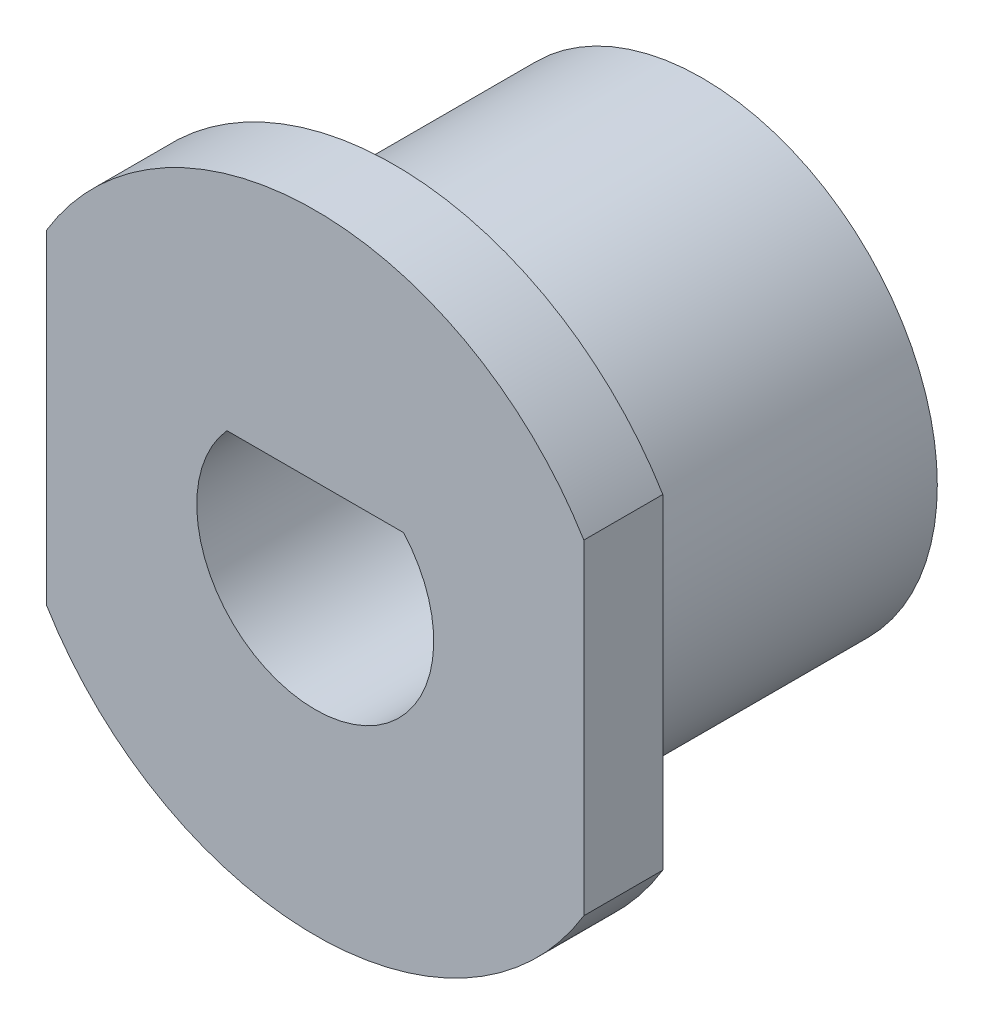
ISO-10303-21;
HEADER;
FILE_DESCRIPTION(('STEP AP214'),'2;1');
FILE_NAME('part.step','',(''),(''),'','','');
FILE_SCHEMA(('AUTOMOTIVE_DESIGN { 1 0 10303 214 1 1 1 1 }'));
ENDSEC;
DATA;
#1=APPLICATION_CONTEXT('core data for automotive mechanical design processes');
#2=APPLICATION_PROTOCOL_DEFINITION('international standard','automotive_design',2000,#1);
#3=PRODUCT_CONTEXT('',#1,'mechanical');
#4=PRODUCT('Part','Part','',(#3));
#5=PRODUCT_RELATED_PRODUCT_CATEGORY('part','',(#4));
#6=PRODUCT_DEFINITION_FORMATION('','',#4);
#7=PRODUCT_DEFINITION_CONTEXT('part definition',#1,'design');
#8=PRODUCT_DEFINITION('design','',#6,#7);
#9=PRODUCT_DEFINITION_SHAPE('','',#8);
#10=(LENGTH_UNIT() NAMED_UNIT(*) SI_UNIT(.MILLI.,.METRE.));
#11=(NAMED_UNIT(*) PLANE_ANGLE_UNIT() SI_UNIT($,.RADIAN.));
#12=(NAMED_UNIT(*) SI_UNIT($,.STERADIAN.) SOLID_ANGLE_UNIT());
#13=UNCERTAINTY_MEASURE_WITH_UNIT(LENGTH_MEASURE(1.E-05),#10,'distance_accuracy_value','');
#14=(GEOMETRIC_REPRESENTATION_CONTEXT(3) GLOBAL_UNCERTAINTY_ASSIGNED_CONTEXT((#13)) GLOBAL_UNIT_ASSIGNED_CONTEXT((#10,
#11,#12)) REPRESENTATION_CONTEXT('',''));
#15=CARTESIAN_POINT('',(0.,0.,0.));
#16=DIRECTION('',(0.,0.,1.));
#17=DIRECTION('',(1.,0.,0.));
#18=AXIS2_PLACEMENT_3D('',#15,#16,#17);
#19=CARTESIAN_POINT('',(0.,0.,4.9));
#20=DIRECTION('',(0.,0.,-1.));
#21=DIRECTION('',(-1.,0.,0.));
#22=AXIS2_PLACEMENT_3D('',#19,#20,#21);
#23=CYLINDRICAL_SURFACE('',#22,2.975);
#24=CARTESIAN_POINT('',(0.,0.,0.));
#25=DIRECTION('',(0.,0.,1.));
#26=DIRECTION('',(1.,0.,0.));
#27=AXIS2_PLACEMENT_3D('',#24,#25,#26);
#28=CIRCLE('',#27,2.975);
#29=CARTESIAN_POINT('',(2.975,0.,0.));
#30=VERTEX_POINT('',#29);
#31=EDGE_CURVE('E130',#30,#30,#28,.T.);
#32=ORIENTED_EDGE('',*,*,#31,.T.);
#33=EDGE_LOOP('',(#32));
#34=FACE_BOUND('',#33,.T.);
#35=CARTESIAN_POINT('',(0.,0.,3.9));
#36=DIRECTION('',(0.,0.,1.));
#37=DIRECTION('',(1.,0.,0.));
#38=AXIS2_PLACEMENT_3D('',#35,#36,#37);
#39=CIRCLE('',#38,2.975);
#40=CARTESIAN_POINT('',(2.975,0.,3.9));
#41=VERTEX_POINT('',#40);
#42=EDGE_CURVE('E11',#41,#41,#39,.T.);
#43=ORIENTED_EDGE('',*,*,#42,.F.);
#44=EDGE_LOOP('',(#43));
#45=FACE_BOUND('',#44,.T.);
#46=ADVANCED_FACE('F39',(#34,#45),#23,.T.);
#47=CARTESIAN_POINT('',(0.,0.,4.9));
#48=DIRECTION('',(0.,0.,-1.));
#49=DIRECTION('',(-1.,0.,0.));
#50=AXIS2_PLACEMENT_3D('',#47,#48,#49);
#51=CYLINDRICAL_SURFACE('',#50,1.5);
#52=CARTESIAN_POINT('',(0.,0.,0.));
#53=DIRECTION('',(0.,0.,1.));
#54=DIRECTION('',(1.,0.,0.));
#55=AXIS2_PLACEMENT_3D('',#52,#53,#54);
#56=CIRCLE('',#55,1.5);
#57=CARTESIAN_POINT('',(-1.1180339887499,1.,0.));
#58=VERTEX_POINT('',#57);
#59=CARTESIAN_POINT('',(1.1180339887499,1.,0.));
#60=VERTEX_POINT('',#59);
#61=EDGE_CURVE('E132',#58,#60,#56,.T.);
#62=ORIENTED_EDGE('',*,*,#61,.F.);
#63=DIRECTION('',(0.,0.,-1.));
#64=VECTOR('',#63,1.);
#65=CARTESIAN_POINT('',(-1.1180339887499,1.,4.9));
#66=LINE('',#65,#64);
#67=CARTESIAN_POINT('',(-1.1180339887499,1.,4.9));
#68=VERTEX_POINT('',#67);
#69=EDGE_CURVE('E48',#68,#58,#66,.T.);
#70=ORIENTED_EDGE('',*,*,#69,.F.);
#71=CARTESIAN_POINT('',(0.,0.,4.9));
#72=DIRECTION('',(0.,0.,1.));
#73=DIRECTION('',(1.,0.,0.));
#74=AXIS2_PLACEMENT_3D('',#71,#72,#73);
#75=CIRCLE('',#74,1.5);
#76=CARTESIAN_POINT('',(1.1180339887499,1.,4.9));
#77=VERTEX_POINT('',#76);
#78=EDGE_CURVE('E127',#68,#77,#75,.T.);
#79=ORIENTED_EDGE('',*,*,#78,.T.);
#80=DIRECTION('',(0.,0.,-1.));
#81=VECTOR('',#80,1.);
#82=CARTESIAN_POINT('',(1.1180339887499,1.,4.9));
#83=LINE('',#82,#81);
#84=EDGE_CURVE('E56',#77,#60,#83,.T.);
#85=ORIENTED_EDGE('',*,*,#84,.T.);
#86=EDGE_LOOP('',(#62,#70,#79,#85));
#87=FACE_BOUND('',#86,.T.);
#88=ADVANCED_FACE('F41',(#87),#51,.F.);
#89=CARTESIAN_POINT('',(0.,1.,4.9));
#90=DIRECTION('',(0.,-1.,0.));
#91=DIRECTION('',(0.,0.,-1.));
#92=AXIS2_PLACEMENT_3D('',#89,#90,#91);
#93=PLANE('',#92);
#94=DIRECTION('',(-1.,0.,0.));
#95=VECTOR('',#94,1.);
#96=CARTESIAN_POINT('',(0.,1.,0.));
#97=LINE('',#96,#95);
#98=EDGE_CURVE('E135',#60,#58,#97,.T.);
#99=ORIENTED_EDGE('',*,*,#98,.F.);
#100=ORIENTED_EDGE('',*,*,#84,.F.);
#101=DIRECTION('',(-1.,0.,0.));
#102=VECTOR('',#101,1.);
#103=CARTESIAN_POINT('',(0.,1.,4.9));
#104=LINE('',#103,#102);
#105=EDGE_CURVE('E129',#77,#68,#104,.T.);
#106=ORIENTED_EDGE('',*,*,#105,.T.);
#107=ORIENTED_EDGE('',*,*,#69,.T.);
#108=EDGE_LOOP('',(#99,#100,#106,#107));
#109=FACE_BOUND('',#108,.T.);
#110=ADVANCED_FACE('F146',(#109),#93,.T.);
#111=CARTESIAN_POINT('',(0.,0.,4.9));
#112=DIRECTION('',(0.,0.,1.));
#113=DIRECTION('',(1.,0.,0.));
#114=AXIS2_PLACEMENT_3D('',#111,#112,#113);
#115=PLANE('',#114);
#116=ORIENTED_EDGE('',*,*,#78,.F.);
#117=ORIENTED_EDGE('',*,*,#105,.F.);
#118=EDGE_LOOP('',(#116,#117));
#119=FACE_BOUND('',#118,.T.);
#120=DIRECTION('',(0.,-1.,0.));
#121=VECTOR('',#120,1.);
#122=CARTESIAN_POINT('',(3.4,0.,4.9));
#123=LINE('',#122,#121);
#124=CARTESIAN_POINT('',(3.4,2.05927778602111,4.9));
#125=VERTEX_POINT('',#124);
#126=CARTESIAN_POINT('',(3.4,-2.05927778602111,4.9));
#127=VERTEX_POINT('',#126);
#128=EDGE_CURVE('E247',#125,#127,#123,.T.);
#129=ORIENTED_EDGE('',*,*,#128,.F.);
#130=CARTESIAN_POINT('',(0.,0.,4.9));
#131=DIRECTION('',(0.,0.,1.));
#132=DIRECTION('',(1.,0.,0.));
#133=AXIS2_PLACEMENT_3D('',#130,#131,#132);
#134=CIRCLE('',#133,3.975);
#135=CARTESIAN_POINT('',(-3.4,2.05927778602111,4.9));
#136=VERTEX_POINT('',#135);
#137=EDGE_CURVE('E244',#125,#136,#134,.T.);
#138=ORIENTED_EDGE('',*,*,#137,.T.);
#139=DIRECTION('',(0.,-1.,0.));
#140=VECTOR('',#139,1.);
#141=CARTESIAN_POINT('',(-3.4,0.,4.9));
#142=LINE('',#141,#140);
#143=CARTESIAN_POINT('',(-3.4,-2.05927778602111,4.9));
#144=VERTEX_POINT('',#143);
#145=EDGE_CURVE('E110',#136,#144,#142,.T.);
#146=ORIENTED_EDGE('',*,*,#145,.T.);
#147=EDGE_CURVE('E120',#144,#127,#134,.T.);
#148=ORIENTED_EDGE('',*,*,#147,.T.);
#149=EDGE_LOOP('',(#129,#138,#146,#148));
#150=FACE_BOUND('',#149,.T.);
#151=ADVANCED_FACE('F148',(#119,#150),#115,.T.);
#152=CARTESIAN_POINT('',(0.,0.,0.));
#153=DIRECTION('',(0.,0.,1.));
#154=DIRECTION('',(1.,0.,0.));
#155=AXIS2_PLACEMENT_3D('',#152,#153,#154);
#156=PLANE('',#155);
#157=ORIENTED_EDGE('',*,*,#61,.T.);
#158=ORIENTED_EDGE('',*,*,#98,.T.);
#159=EDGE_LOOP('',(#157,#158));
#160=FACE_BOUND('',#159,.T.);
#161=ORIENTED_EDGE('',*,*,#31,.F.);
#162=EDGE_LOOP('',(#161));
#163=FACE_BOUND('',#162,.T.);
#164=ADVANCED_FACE('F144',(#160,#163),#156,.F.);
#165=CARTESIAN_POINT('',(3.4,0.,3.9));
#166=DIRECTION('',(-1.,0.,0.));
#167=DIRECTION('',(0.,0.,1.));
#168=AXIS2_PLACEMENT_3D('',#165,#166,#167);
#169=PLANE('',#168);
#170=ORIENTED_EDGE('',*,*,#128,.T.);
#171=DIRECTION('',(0.,0.,1.));
#172=VECTOR('',#171,1.);
#173=CARTESIAN_POINT('',(3.4,-2.05927778602111,3.9));
#174=LINE('',#173,#172);
#175=CARTESIAN_POINT('',(3.4,-2.05927778602111,3.9));
#176=VERTEX_POINT('',#175);
#177=EDGE_CURVE('E93',#176,#127,#174,.T.);
#178=ORIENTED_EDGE('',*,*,#177,.F.);
#179=DIRECTION('',(0.,-1.,0.));
#180=VECTOR('',#179,1.);
#181=CARTESIAN_POINT('',(3.4,0.,3.9));
#182=LINE('',#181,#180);
#183=CARTESIAN_POINT('',(3.4,2.05927778602111,3.9));
#184=VERTEX_POINT('',#183);
#185=EDGE_CURVE('E72',#184,#176,#182,.T.);
#186=ORIENTED_EDGE('',*,*,#185,.F.);
#187=DIRECTION('',(0.,0.,1.));
#188=VECTOR('',#187,1.);
#189=CARTESIAN_POINT('',(3.4,2.05927778602111,3.9));
#190=LINE('',#189,#188);
#191=EDGE_CURVE('E100',#184,#125,#190,.T.);
#192=ORIENTED_EDGE('',*,*,#191,.T.);
#193=EDGE_LOOP('',(#170,#178,#186,#192));
#194=FACE_BOUND('',#193,.T.);
#195=ADVANCED_FACE('F163',(#194),#169,.F.);
#196=CARTESIAN_POINT('',(0.,0.,3.9));
#197=DIRECTION('',(0.,0.,1.));
#198=DIRECTION('',(1.,0.,0.));
#199=AXIS2_PLACEMENT_3D('',#196,#197,#198);
#200=CYLINDRICAL_SURFACE('',#199,3.975);
#201=ORIENTED_EDGE('',*,*,#147,.F.);
#202=DIRECTION('',(0.,0.,1.));
#203=VECTOR('',#202,1.);
#204=CARTESIAN_POINT('',(-3.4,-2.05927778602111,3.9));
#205=LINE('',#204,#203);
#206=CARTESIAN_POINT('',(-3.4,-2.05927778602111,3.9));
#207=VERTEX_POINT('',#206);
#208=EDGE_CURVE('E112',#207,#144,#205,.T.);
#209=ORIENTED_EDGE('',*,*,#208,.F.);
#210=CARTESIAN_POINT('',(0.,0.,3.9));
#211=DIRECTION('',(0.,0.,1.));
#212=DIRECTION('',(1.,0.,0.));
#213=AXIS2_PLACEMENT_3D('',#210,#211,#212);
#214=CIRCLE('',#213,3.975);
#215=EDGE_CURVE('E116',#207,#176,#214,.T.);
#216=ORIENTED_EDGE('',*,*,#215,.T.);
#217=ORIENTED_EDGE('',*,*,#177,.T.);
#218=EDGE_LOOP('',(#201,#209,#216,#217));
#219=FACE_BOUND('',#218,.T.);
#220=ADVANCED_FACE('F167',(#219),#200,.T.);
#221=CARTESIAN_POINT('',(-3.4,0.,3.9));
#222=DIRECTION('',(-1.,0.,0.));
#223=DIRECTION('',(0.,0.,1.));
#224=AXIS2_PLACEMENT_3D('',#221,#222,#223);
#225=PLANE('',#224);
#226=ORIENTED_EDGE('',*,*,#145,.F.);
#227=DIRECTION('',(0.,0.,1.));
#228=VECTOR('',#227,1.);
#229=CARTESIAN_POINT('',(-3.4,2.05927778602111,3.9));
#230=LINE('',#229,#228);
#231=CARTESIAN_POINT('',(-3.4,2.05927778602111,3.9));
#232=VERTEX_POINT('',#231);
#233=EDGE_CURVE('E105',#232,#136,#230,.T.);
#234=ORIENTED_EDGE('',*,*,#233,.F.);
#235=DIRECTION('',(0.,-1.,0.));
#236=VECTOR('',#235,1.);
#237=CARTESIAN_POINT('',(-3.4,0.,3.9));
#238=LINE('',#237,#236);
#239=EDGE_CURVE('E108',#232,#207,#238,.T.);
#240=ORIENTED_EDGE('',*,*,#239,.T.);
#241=ORIENTED_EDGE('',*,*,#208,.T.);
#242=EDGE_LOOP('',(#226,#234,#240,#241));
#243=FACE_BOUND('',#242,.T.);
#244=ADVANCED_FACE('F107',(#243),#225,.T.);
#245=ORIENTED_EDGE('',*,*,#137,.F.);
#246=ORIENTED_EDGE('',*,*,#191,.F.);
#247=EDGE_CURVE('E115',#184,#232,#214,.T.);
#248=ORIENTED_EDGE('',*,*,#247,.T.);
#249=ORIENTED_EDGE('',*,*,#233,.T.);
#250=EDGE_LOOP('',(#245,#246,#248,#249));
#251=FACE_BOUND('',#250,.T.);
#252=ADVANCED_FACE('F118',(#251),#200,.T.);
#253=CARTESIAN_POINT('',(0.,0.,3.9));
#254=DIRECTION('',(0.,0.,1.));
#255=DIRECTION('',(1.,0.,0.));
#256=AXIS2_PLACEMENT_3D('',#253,#254,#255);
#257=PLANE('',#256);
#258=ORIENTED_EDGE('',*,*,#42,.T.);
#259=EDGE_LOOP('',(#258));
#260=FACE_BOUND('',#259,.T.);
#261=ORIENTED_EDGE('',*,*,#185,.T.);
#262=ORIENTED_EDGE('',*,*,#215,.F.);
#263=ORIENTED_EDGE('',*,*,#239,.F.);
#264=ORIENTED_EDGE('',*,*,#247,.F.);
#265=EDGE_LOOP('',(#261,#262,#263,#264));
#266=FACE_BOUND('',#265,.T.);
#267=ADVANCED_FACE('F114',(#260,#266),#257,.F.);
#268=CLOSED_SHELL('',(#46,#88,#110,#151,#164,#195,#220,#244,#252,#267));
#269=MANIFOLD_SOLID_BREP('B2',#268);
#270=ADVANCED_BREP_SHAPE_REPRESENTATION('',(#18,#269),#14);
#271=SHAPE_DEFINITION_REPRESENTATION(#9,#270);
ENDSEC;
END-ISO-10303-21;
